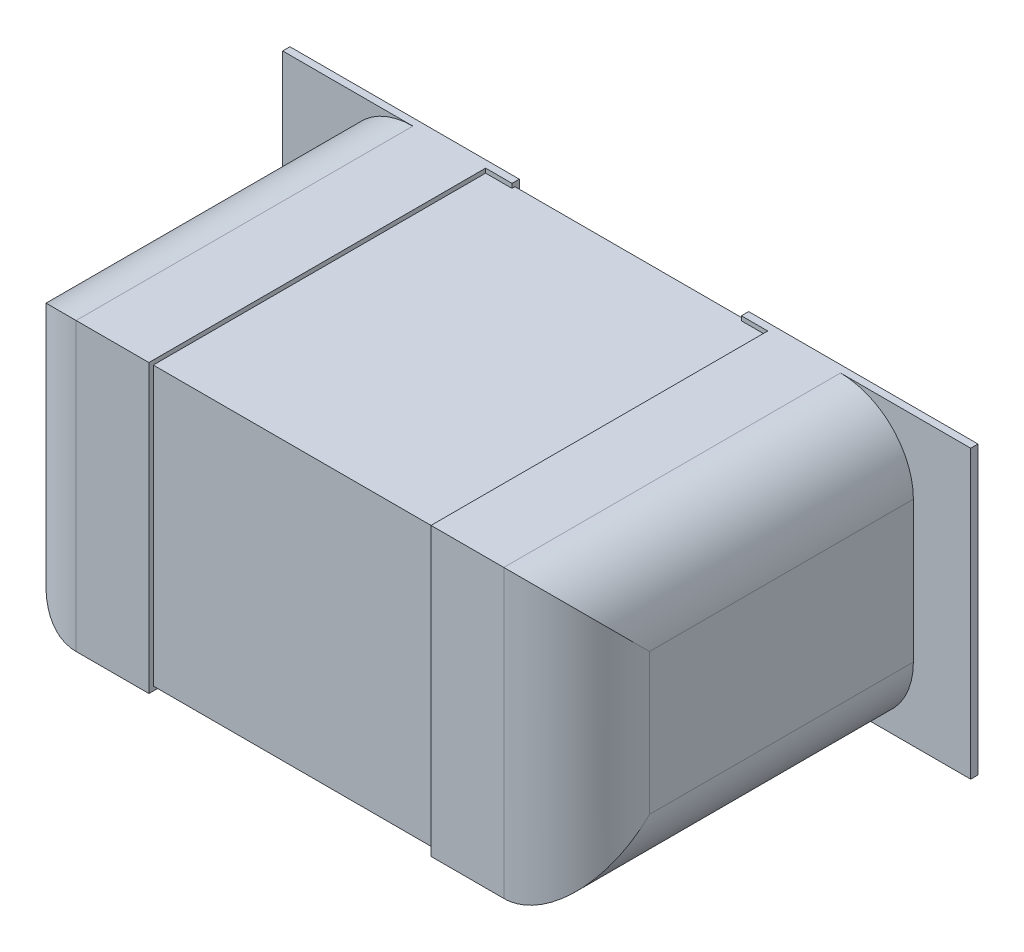
ISO-10303-21;
HEADER;
FILE_DESCRIPTION(('STEP AP214'),'2;1');
FILE_NAME('part.step','',(''),(''),'','','');
FILE_SCHEMA(('AUTOMOTIVE_DESIGN { 1 0 10303 214 1 1 1 1 }'));
ENDSEC;
DATA;
#1=APPLICATION_CONTEXT('core data for automotive mechanical design processes');
#2=APPLICATION_PROTOCOL_DEFINITION('international standard','automotive_design',2000,#1);
#3=PRODUCT_CONTEXT('',#1,'mechanical');
#4=PRODUCT('Part','Part','',(#3));
#5=PRODUCT_RELATED_PRODUCT_CATEGORY('part','',(#4));
#6=PRODUCT_DEFINITION_FORMATION('','',#4);
#7=PRODUCT_DEFINITION_CONTEXT('part definition',#1,'design');
#8=PRODUCT_DEFINITION('design','',#6,#7);
#9=PRODUCT_DEFINITION_SHAPE('','',#8);
#10=(LENGTH_UNIT() NAMED_UNIT(*) SI_UNIT(.MILLI.,.METRE.));
#11=(NAMED_UNIT(*) PLANE_ANGLE_UNIT() SI_UNIT($,.RADIAN.));
#12=(NAMED_UNIT(*) SI_UNIT($,.STERADIAN.) SOLID_ANGLE_UNIT());
#13=UNCERTAINTY_MEASURE_WITH_UNIT(LENGTH_MEASURE(1.E-05),#10,'distance_accuracy_value','');
#14=(GEOMETRIC_REPRESENTATION_CONTEXT(3) GLOBAL_UNCERTAINTY_ASSIGNED_CONTEXT((#13)) GLOBAL_UNIT_ASSIGNED_CONTEXT((#10,
#11,#12)) REPRESENTATION_CONTEXT('',''));
#15=CARTESIAN_POINT('',(0.,0.,0.));
#16=DIRECTION('',(0.,0.,1.));
#17=DIRECTION('',(1.,0.,0.));
#18=AXIS2_PLACEMENT_3D('',#15,#16,#17);
#19=CARTESIAN_POINT('',(0.500000000000032,-0.249999999999991,0.0762));
#20=DIRECTION('',(1.,0.,0.));
#21=DIRECTION('',(0.,0.,-1.));
#22=AXIS2_PLACEMENT_3D('',#19,#20,#21);
#23=PLANE('',#22);
#24=DIRECTION('',(0.,0.,-1.));
#25=VECTOR('',#24,1.);
#26=CARTESIAN_POINT('',(0.500000000000032,-0.122999999999991,0.678388339111896));
#27=LINE('',#26,#25);
#28=CARTESIAN_POINT('',(0.500000000000032,-0.122999999999991,0.0889));
#29=VERTEX_POINT('',#28);
#30=CARTESIAN_POINT('',(0.500000000000032,-0.122999999999991,0.549148));
#31=VERTEX_POINT('',#30);
#32=EDGE_CURVE('E325',#29,#31,#27,.F.);
#33=ORIENTED_EDGE('',*,*,#32,.F.);
#34=DIRECTION('',(0.,1.,0.));
#35=VECTOR('',#34,1.);
#36=CARTESIAN_POINT('',(0.500000000000032,0.,0.0889));
#37=LINE('',#36,#35);
#38=CARTESIAN_POINT('',(0.500000000000032,0.122999999999991,0.0889));
#39=VERTEX_POINT('',#38);
#40=EDGE_CURVE('E238',#39,#29,#37,.F.);
#41=ORIENTED_EDGE('',*,*,#40,.F.);
#42=DIRECTION('',(0.,0.,-1.));
#43=VECTOR('',#42,1.);
#44=CARTESIAN_POINT('',(0.500000000000032,0.122999999999991,0.678388339111896));
#45=LINE('',#44,#43);
#46=CARTESIAN_POINT('',(0.500000000000032,0.122999999999991,0.549148));
#47=VERTEX_POINT('',#46);
#48=EDGE_CURVE('E227',#47,#39,#45,.T.);
#49=ORIENTED_EDGE('',*,*,#48,.F.);
#50=DIRECTION('',(0.,1.,0.));
#51=VECTOR('',#50,1.);
#52=CARTESIAN_POINT('',(0.500000000000032,-0.252159075277437,0.549148));
#53=LINE('',#52,#51);
#54=EDGE_CURVE('E224',#31,#47,#53,.T.);
#55=ORIENTED_EDGE('',*,*,#54,.F.);
#56=EDGE_LOOP('',(#33,#41,#49,#55));
#57=FACE_BOUND('',#56,.T.);
#58=ADVANCED_FACE('F17',(#57),#23,.T.);
#59=CARTESIAN_POINT('',(-0.500000000000032,0.249999999999991,0.0762));
#60=DIRECTION('',(-1.,0.,0.));
#61=DIRECTION('',(0.,0.,1.));
#62=AXIS2_PLACEMENT_3D('',#59,#60,#61);
#63=PLANE('',#62);
#64=DIRECTION('',(0.,0.,-1.));
#65=VECTOR('',#64,1.);
#66=CARTESIAN_POINT('',(-0.500000000000032,0.122999999999991,0.678388339111896));
#67=LINE('',#66,#65);
#68=CARTESIAN_POINT('',(-0.500000000000032,0.122999999999991,0.0889));
#69=VERTEX_POINT('',#68);
#70=CARTESIAN_POINT('',(-0.500000000000032,0.122999999999991,0.549148));
#71=VERTEX_POINT('',#70);
#72=EDGE_CURVE('E309',#69,#71,#67,.F.);
#73=ORIENTED_EDGE('',*,*,#72,.F.);
#74=DIRECTION('',(0.,1.,0.));
#75=VECTOR('',#74,1.);
#76=CARTESIAN_POINT('',(-0.500000000000032,0.,0.0889));
#77=LINE('',#76,#75);
#78=CARTESIAN_POINT('',(-0.500000000000032,-0.122999999999991,0.0889));
#79=VERTEX_POINT('',#78);
#80=EDGE_CURVE('E313',#79,#69,#77,.T.);
#81=ORIENTED_EDGE('',*,*,#80,.F.);
#82=DIRECTION('',(0.,0.,-1.));
#83=VECTOR('',#82,1.);
#84=CARTESIAN_POINT('',(-0.500000000000032,-0.122999999999991,0.678388339111896));
#85=LINE('',#84,#83);
#86=CARTESIAN_POINT('',(-0.500000000000032,-0.122999999999991,0.549148));
#87=VERTEX_POINT('',#86);
#88=EDGE_CURVE('E316',#87,#79,#85,.T.);
#89=ORIENTED_EDGE('',*,*,#88,.F.);
#90=DIRECTION('',(0.,-1.,0.));
#91=VECTOR('',#90,1.);
#92=CARTESIAN_POINT('',(-0.500000000000032,0.252201511148649,0.549148));
#93=LINE('',#92,#91);
#94=EDGE_CURVE('E243',#71,#87,#93,.T.);
#95=ORIENTED_EDGE('',*,*,#94,.F.);
#96=EDGE_LOOP('',(#73,#81,#89,#95));
#97=FACE_BOUND('',#96,.T.);
#98=ADVANCED_FACE('F356',(#97),#63,.T.);
#99=CARTESIAN_POINT('',(-0.373000000000032,0.252201511148649,0.549148));
#100=DIRECTION('',(0.,-1.,0.));
#101=DIRECTION('',(0.,0.,-1.));
#102=AXIS2_PLACEMENT_3D('',#99,#100,#101);
#103=CYLINDRICAL_SURFACE('',#102,0.127);
#104=CARTESIAN_POINT('',(-0.373000000000032,-0.122999999999991,0.549148));
#105=DIRECTION('',(0.,-0.707106781186547,-0.707106781186547));
#106=DIRECTION('',(0.,0.707106781186547,-0.707106781186547));
#107=AXIS2_PLACEMENT_3D('',#104,#105,#106);
#108=ELLIPSE('',#107,0.179605122421383,0.127);
#109=CARTESIAN_POINT('',(-0.373000000000032,-0.249999999999991,0.676148));
#110=VERTEX_POINT('',#109);
#111=EDGE_CURVE('E317',#110,#87,#108,.T.);
#112=ORIENTED_EDGE('',*,*,#111,.F.);
#113=DIRECTION('',(0.,1.,0.));
#114=VECTOR('',#113,1.);
#115=CARTESIAN_POINT('',(-0.373000000000032,0.,0.676148));
#116=LINE('',#115,#114);
#117=CARTESIAN_POINT('',(-0.373000000000032,0.249999999999991,0.676148));
#118=VERTEX_POINT('',#117);
#119=EDGE_CURVE('E208',#118,#110,#116,.F.);
#120=ORIENTED_EDGE('',*,*,#119,.F.);
#121=CARTESIAN_POINT('',(-0.373000000000032,0.122999999999991,0.549148));
#122=DIRECTION('',(0.,0.707106781186547,-0.707106781186547));
#123=DIRECTION('',(0.,-0.707106781186547,-0.707106781186547));
#124=AXIS2_PLACEMENT_3D('',#121,#122,#123);
#125=ELLIPSE('',#124,0.179605122421383,0.127);
#126=EDGE_CURVE('E307',#71,#118,#125,.T.);
#127=ORIENTED_EDGE('',*,*,#126,.F.);
#128=ORIENTED_EDGE('',*,*,#94,.T.);
#129=EDGE_LOOP('',(#112,#120,#127,#128));
#130=FACE_BOUND('',#129,.T.);
#131=ADVANCED_FACE('F361',(#130),#103,.T.);
#132=CARTESIAN_POINT('',(0.373000000000032,-0.252159075277437,0.549148));
#133=DIRECTION('',(0.,1.,0.));
#134=DIRECTION('',(0.,0.,1.));
#135=AXIS2_PLACEMENT_3D('',#132,#133,#134);
#136=CYLINDRICAL_SURFACE('',#135,0.127);
#137=CARTESIAN_POINT('',(0.373000000000032,-0.122999999999991,0.549148));
#138=DIRECTION('',(0.,-0.707106781186547,-0.707106781186547));
#139=DIRECTION('',(0.,0.707106781186547,-0.707106781186547));
#140=AXIS2_PLACEMENT_3D('',#137,#138,#139);
#141=ELLIPSE('',#140,0.179605122421383,0.127);
#142=CARTESIAN_POINT('',(0.373000000000032,-0.249999999999991,0.676148));
#143=VERTEX_POINT('',#142);
#144=EDGE_CURVE('E323',#31,#143,#141,.T.);
#145=ORIENTED_EDGE('',*,*,#144,.F.);
#146=ORIENTED_EDGE('',*,*,#54,.T.);
#147=CARTESIAN_POINT('',(0.373000000000032,0.122999999999991,0.549148));
#148=DIRECTION('',(0.,0.707106781186547,-0.707106781186547));
#149=DIRECTION('',(0.,-0.707106781186547,-0.707106781186547));
#150=AXIS2_PLACEMENT_3D('',#147,#148,#149);
#151=ELLIPSE('',#150,0.179605122421383,0.127);
#152=CARTESIAN_POINT('',(0.373000000000032,0.249999999999991,0.676148));
#153=VERTEX_POINT('',#152);
#154=EDGE_CURVE('E20',#153,#47,#151,.T.);
#155=ORIENTED_EDGE('',*,*,#154,.F.);
#156=DIRECTION('',(0.,1.,0.));
#157=VECTOR('',#156,1.);
#158=CARTESIAN_POINT('',(0.373000000000032,0.,0.676148));
#159=LINE('',#158,#157);
#160=EDGE_CURVE('E198',#143,#153,#159,.T.);
#161=ORIENTED_EDGE('',*,*,#160,.F.);
#162=EDGE_LOOP('',(#145,#146,#155,#161));
#163=FACE_BOUND('',#162,.T.);
#164=ADVANCED_FACE('F222',(#163),#136,.T.);
#165=CARTESIAN_POINT('',(0.373000000000032,0.122999999999991,0.678388339111896));
#166=DIRECTION('',(0.,0.,-1.));
#167=DIRECTION('',(-1.,0.,0.));
#168=AXIS2_PLACEMENT_3D('',#165,#166,#167);
#169=CYLINDRICAL_SURFACE('',#168,0.127);
#170=ORIENTED_EDGE('',*,*,#48,.T.);
#171=CARTESIAN_POINT('',(0.373000000000032,0.122999999999991,0.0889));
#172=DIRECTION('',(0.,0.,-1.));
#173=DIRECTION('',(-1.,0.,0.));
#174=AXIS2_PLACEMENT_3D('',#171,#172,#173);
#175=CIRCLE('',#174,0.127);
#176=CARTESIAN_POINT('',(0.37286056684417,0.249999999999991,0.0889000165531471));
#177=VERTEX_POINT('',#176);
#178=EDGE_CURVE('E230',#177,#39,#175,.T.);
#179=ORIENTED_EDGE('',*,*,#178,.F.);
#180=DIRECTION('',(-0.000237434875660237,0.,-0.999999971812339));
#181=VECTOR('',#180,1.);
#182=CARTESIAN_POINT('',(0.373000000000032,0.249999999999991,0.676148));
#183=LINE('',#182,#181);
#184=EDGE_CURVE('E215',#153,#177,#183,.T.);
#185=ORIENTED_EDGE('',*,*,#184,.F.);
#186=ORIENTED_EDGE('',*,*,#154,.T.);
#187=EDGE_LOOP('',(#170,#179,#185,#186));
#188=FACE_BOUND('',#187,.T.);
#189=ADVANCED_FACE('F228',(#188),#169,.T.);
#190=CARTESIAN_POINT('',(0.5999988,-0.2500122,0.0762));
#191=DIRECTION('',(1.,0.,0.));
#192=DIRECTION('',(0.,0.,-1.));
#193=AXIS2_PLACEMENT_3D('',#190,#191,#192);
#194=PLANE('',#193);
#195=DIRECTION('',(0.,0.,-1.));
#196=VECTOR('',#195,1.);
#197=CARTESIAN_POINT('',(0.5999988,-0.249999999999991,0.0762));
#198=LINE('',#197,#196);
#199=CARTESIAN_POINT('',(0.5999988,-0.249999999999991,0.0762));
#200=VERTEX_POINT('',#199);
#201=CARTESIAN_POINT('',(0.5999988,-0.249999999999991,0.0889));
#202=VERTEX_POINT('',#201);
#203=EDGE_CURVE('E295',#200,#202,#198,.F.);
#204=ORIENTED_EDGE('',*,*,#203,.F.);
#205=DIRECTION('',(0.,1.,0.));
#206=VECTOR('',#205,1.);
#207=CARTESIAN_POINT('',(0.5999988,0.,0.0762));
#208=LINE('',#207,#206);
#209=CARTESIAN_POINT('',(0.5999988,0.249999999999991,0.0762));
#210=VERTEX_POINT('',#209);
#211=EDGE_CURVE('E298',#200,#210,#208,.T.);
#212=ORIENTED_EDGE('',*,*,#211,.T.);
#213=DIRECTION('',(0.,0.,1.));
#214=VECTOR('',#213,1.);
#215=CARTESIAN_POINT('',(0.5999988,0.249999999999991,0.0762));
#216=LINE('',#215,#214);
#217=CARTESIAN_POINT('',(0.5999988,0.249999999999991,0.0889));
#218=VERTEX_POINT('',#217);
#219=EDGE_CURVE('E234',#218,#210,#216,.F.);
#220=ORIENTED_EDGE('',*,*,#219,.F.);
#221=DIRECTION('',(0.,1.,0.));
#222=VECTOR('',#221,1.);
#223=CARTESIAN_POINT('',(0.5999988,0.,0.0889));
#224=LINE('',#223,#222);
#225=EDGE_CURVE('E241',#202,#218,#224,.T.);
#226=ORIENTED_EDGE('',*,*,#225,.F.);
#227=EDGE_LOOP('',(#204,#212,#220,#226));
#228=FACE_BOUND('',#227,.T.);
#229=ADVANCED_FACE('F336',(#228),#194,.T.);
#230=CARTESIAN_POINT('',(0.,0.,0.0889));
#231=DIRECTION('',(0.,0.,1.));
#232=DIRECTION('',(1.,0.,0.));
#233=AXIS2_PLACEMENT_3D('',#230,#231,#232);
#234=PLANE('',#233);
#235=ORIENTED_EDGE('',*,*,#178,.T.);
#236=ORIENTED_EDGE('',*,*,#40,.T.);
#237=CARTESIAN_POINT('',(0.373000000000032,-0.122999999999991,0.0889));
#238=DIRECTION('',(0.,0.,-1.));
#239=DIRECTION('',(-1.,0.,0.));
#240=AXIS2_PLACEMENT_3D('',#237,#238,#239);
#241=CIRCLE('',#240,0.127);
#242=CARTESIAN_POINT('',(0.37286056684417,-0.249999999999991,0.088900016553147));
#243=VERTEX_POINT('',#242);
#244=EDGE_CURVE('E320',#243,#29,#241,.F.);
#245=ORIENTED_EDGE('',*,*,#244,.F.);
#246=DIRECTION('',(1.,0.,0.));
#247=VECTOR('',#246,1.);
#248=CARTESIAN_POINT('',(-0.500000000000032,-0.249999999999991,0.0889));
#249=LINE('',#248,#247);
#250=EDGE_CURVE('E297',#202,#243,#249,.F.);
#251=ORIENTED_EDGE('',*,*,#250,.F.);
#252=ORIENTED_EDGE('',*,*,#225,.T.);
#253=DIRECTION('',(1.,0.,0.));
#254=VECTOR('',#253,1.);
#255=CARTESIAN_POINT('',(0.500000000000032,0.249999999999991,0.0889));
#256=LINE('',#255,#254);
#257=EDGE_CURVE('E232',#177,#218,#256,.T.);
#258=ORIENTED_EDGE('',*,*,#257,.F.);
#259=EDGE_LOOP('',(#235,#236,#245,#251,#252,#258));
#260=FACE_BOUND('',#259,.T.);
#261=ADVANCED_FACE('F329',(#260),#234,.T.);
#262=CARTESIAN_POINT('',(0.373000000000032,-0.122999999999991,0.678388339111896));
#263=DIRECTION('',(0.,0.,-1.));
#264=DIRECTION('',(-1.,0.,0.));
#265=AXIS2_PLACEMENT_3D('',#262,#263,#264);
#266=CYLINDRICAL_SURFACE('',#265,0.127);
#267=DIRECTION('',(0.000237434875660237,0.,0.999999971812339));
#268=VECTOR('',#267,1.);
#269=CARTESIAN_POINT('',(0.37286056684024,-0.249999999999991,0.0889));
#270=LINE('',#269,#268);
#271=EDGE_CURVE('E343',#243,#143,#270,.T.);
#272=ORIENTED_EDGE('',*,*,#271,.F.);
#273=ORIENTED_EDGE('',*,*,#244,.T.);
#274=ORIENTED_EDGE('',*,*,#32,.T.);
#275=ORIENTED_EDGE('',*,*,#144,.T.);
#276=EDGE_LOOP('',(#272,#273,#274,#275));
#277=FACE_BOUND('',#276,.T.);
#278=ADVANCED_FACE('F353',(#277),#266,.T.);
#279=CARTESIAN_POINT('',(-0.373000000000032,-0.122999999999991,0.678388339111896));
#280=DIRECTION('',(0.,0.,-1.));
#281=DIRECTION('',(-1.,0.,0.));
#282=AXIS2_PLACEMENT_3D('',#279,#280,#281);
#283=CYLINDRICAL_SURFACE('',#282,0.127);
#284=ORIENTED_EDGE('',*,*,#88,.T.);
#285=CARTESIAN_POINT('',(-0.373000000000032,-0.122999999999991,0.0889));
#286=DIRECTION('',(0.,0.,-1.));
#287=DIRECTION('',(-1.,0.,0.));
#288=AXIS2_PLACEMENT_3D('',#285,#286,#287);
#289=CIRCLE('',#288,0.127);
#290=CARTESIAN_POINT('',(-0.37286056684417,-0.249999999999991,0.0889000165531471));
#291=VERTEX_POINT('',#290);
#292=EDGE_CURVE('E310',#291,#79,#289,.T.);
#293=ORIENTED_EDGE('',*,*,#292,.F.);
#294=DIRECTION('',(0.000237434875660237,0.,-0.999999971812339));
#295=VECTOR('',#294,1.);
#296=CARTESIAN_POINT('',(-0.373000000000032,-0.249999999999991,0.676148));
#297=LINE('',#296,#295);
#298=EDGE_CURVE('E290',#110,#291,#297,.T.);
#299=ORIENTED_EDGE('',*,*,#298,.F.);
#300=ORIENTED_EDGE('',*,*,#111,.T.);
#301=EDGE_LOOP('',(#284,#293,#299,#300));
#302=FACE_BOUND('',#301,.T.);
#303=ADVANCED_FACE('F450',(#302),#283,.T.);
#304=CARTESIAN_POINT('',(-0.5999988,0.2500122,0.0762));
#305=DIRECTION('',(-1.,0.,0.));
#306=DIRECTION('',(0.,0.,1.));
#307=AXIS2_PLACEMENT_3D('',#304,#305,#306);
#308=PLANE('',#307);
#309=DIRECTION('',(0.,0.,1.));
#310=VECTOR('',#309,1.);
#311=CARTESIAN_POINT('',(-0.5999988,0.249999999999991,0.0762));
#312=LINE('',#311,#310);
#313=CARTESIAN_POINT('',(-0.5999988,0.249999999999991,0.0762));
#314=VERTEX_POINT('',#313);
#315=CARTESIAN_POINT('',(-0.5999988,0.249999999999991,0.0889));
#316=VERTEX_POINT('',#315);
#317=EDGE_CURVE('E278',#314,#316,#312,.T.);
#318=ORIENTED_EDGE('',*,*,#317,.F.);
#319=DIRECTION('',(0.,1.,0.));
#320=VECTOR('',#319,1.);
#321=CARTESIAN_POINT('',(-0.5999988,0.,0.0762));
#322=LINE('',#321,#320);
#323=CARTESIAN_POINT('',(-0.5999988,-0.249999999999991,0.0762));
#324=VERTEX_POINT('',#323);
#325=EDGE_CURVE('E281',#314,#324,#322,.F.);
#326=ORIENTED_EDGE('',*,*,#325,.T.);
#327=DIRECTION('',(0.,0.,-1.));
#328=VECTOR('',#327,1.);
#329=CARTESIAN_POINT('',(-0.5999988,-0.249999999999991,0.0762));
#330=LINE('',#329,#328);
#331=CARTESIAN_POINT('',(-0.5999988,-0.249999999999991,0.0889));
#332=VERTEX_POINT('',#331);
#333=EDGE_CURVE('E285',#332,#324,#330,.T.);
#334=ORIENTED_EDGE('',*,*,#333,.F.);
#335=DIRECTION('',(0.,1.,0.));
#336=VECTOR('',#335,1.);
#337=CARTESIAN_POINT('',(-0.5999988,0.,0.0889));
#338=LINE('',#337,#336);
#339=EDGE_CURVE('E314',#316,#332,#338,.F.);
#340=ORIENTED_EDGE('',*,*,#339,.F.);
#341=EDGE_LOOP('',(#318,#326,#334,#340));
#342=FACE_BOUND('',#341,.T.);
#343=ADVANCED_FACE('F446',(#342),#308,.T.);
#344=CARTESIAN_POINT('',(0.,0.,0.0889));
#345=DIRECTION('',(0.,0.,1.));
#346=DIRECTION('',(1.,0.,0.));
#347=AXIS2_PLACEMENT_3D('',#344,#345,#346);
#348=PLANE('',#347);
#349=ORIENTED_EDGE('',*,*,#292,.T.);
#350=ORIENTED_EDGE('',*,*,#80,.T.);
#351=CARTESIAN_POINT('',(-0.373000000000032,0.122999999999991,0.0889));
#352=DIRECTION('',(0.,0.,-1.));
#353=DIRECTION('',(-1.,0.,0.));
#354=AXIS2_PLACEMENT_3D('',#351,#352,#353);
#355=CIRCLE('',#354,0.127);
#356=CARTESIAN_POINT('',(-0.37286056684417,0.249999999999991,0.088900016553147));
#357=VERTEX_POINT('',#356);
#358=EDGE_CURVE('E304',#357,#69,#355,.F.);
#359=ORIENTED_EDGE('',*,*,#358,.F.);
#360=DIRECTION('',(1.,0.,0.));
#361=VECTOR('',#360,1.);
#362=CARTESIAN_POINT('',(0.500000000000032,0.249999999999991,0.0889));
#363=LINE('',#362,#361);
#364=EDGE_CURVE('E280',#316,#357,#363,.T.);
#365=ORIENTED_EDGE('',*,*,#364,.F.);
#366=ORIENTED_EDGE('',*,*,#339,.T.);
#367=DIRECTION('',(1.,0.,0.));
#368=VECTOR('',#367,1.);
#369=CARTESIAN_POINT('',(-0.500000000000032,-0.249999999999991,0.0889));
#370=LINE('',#369,#368);
#371=EDGE_CURVE('E287',#291,#332,#370,.F.);
#372=ORIENTED_EDGE('',*,*,#371,.F.);
#373=EDGE_LOOP('',(#349,#350,#359,#365,#366,#372));
#374=FACE_BOUND('',#373,.T.);
#375=ADVANCED_FACE('F442',(#374),#348,.T.);
#376=CARTESIAN_POINT('',(-0.373000000000032,0.122999999999991,0.678388339111896));
#377=DIRECTION('',(0.,0.,-1.));
#378=DIRECTION('',(-1.,0.,0.));
#379=AXIS2_PLACEMENT_3D('',#376,#377,#378);
#380=CYLINDRICAL_SURFACE('',#379,0.127);
#381=DIRECTION('',(-0.000237434875660237,0.,0.999999971812339));
#382=VECTOR('',#381,1.);
#383=CARTESIAN_POINT('',(-0.37286056684024,0.249999999999991,0.0889));
#384=LINE('',#383,#382);
#385=EDGE_CURVE('E483',#357,#118,#384,.T.);
#386=ORIENTED_EDGE('',*,*,#385,.F.);
#387=ORIENTED_EDGE('',*,*,#358,.T.);
#388=ORIENTED_EDGE('',*,*,#72,.T.);
#389=ORIENTED_EDGE('',*,*,#126,.T.);
#390=EDGE_LOOP('',(#386,#387,#388,#389));
#391=FACE_BOUND('',#390,.T.);
#392=ADVANCED_FACE('F438',(#391),#380,.T.);
#393=CARTESIAN_POINT('',(0.,0.,0.676148));
#394=DIRECTION('',(0.,0.,1.));
#395=DIRECTION('',(1.,0.,0.));
#396=AXIS2_PLACEMENT_3D('',#393,#394,#395);
#397=PLANE('',#396);
#398=DIRECTION('',(1.,0.,0.));
#399=VECTOR('',#398,1.);
#400=CARTESIAN_POINT('',(0.500000000000032,0.249999999999991,0.676148));
#401=LINE('',#400,#399);
#402=CARTESIAN_POINT('',(-0.246000000000007,0.249999999999991,0.676148));
#403=VERTEX_POINT('',#402);
#404=EDGE_CURVE('E277',#118,#403,#401,.T.);
#405=ORIENTED_EDGE('',*,*,#404,.F.);
#406=ORIENTED_EDGE('',*,*,#119,.T.);
#407=DIRECTION('',(1.,0.,0.));
#408=VECTOR('',#407,1.);
#409=CARTESIAN_POINT('',(-0.500000000000032,-0.249999999999991,0.676148));
#410=LINE('',#409,#408);
#411=CARTESIAN_POINT('',(-0.246000000000007,-0.250002711111104,0.676148));
#412=VERTEX_POINT('',#411);
#413=EDGE_CURVE('E294',#412,#110,#410,.F.);
#414=ORIENTED_EDGE('',*,*,#413,.F.);
#415=DIRECTION('',(0.,1.,0.));
#416=VECTOR('',#415,1.);
#417=CARTESIAN_POINT('',(-0.246000000000007,-0.249999999999991,0.676148));
#418=LINE('',#417,#416);
#419=EDGE_CURVE('E514',#412,#403,#418,.T.);
#420=ORIENTED_EDGE('',*,*,#419,.T.);
#421=EDGE_LOOP('',(#405,#406,#414,#420));
#422=FACE_BOUND('',#421,.T.);
#423=ADVANCED_FACE('F435',(#422),#397,.T.);
#424=CARTESIAN_POINT('',(0.,0.,0.676148));
#425=DIRECTION('',(0.,0.,1.));
#426=DIRECTION('',(1.,0.,0.));
#427=AXIS2_PLACEMENT_3D('',#424,#425,#426);
#428=PLANE('',#427);
#429=DIRECTION('',(1.,0.,0.));
#430=VECTOR('',#429,1.);
#431=CARTESIAN_POINT('',(-0.500000000000032,-0.249999999999991,0.676148));
#432=LINE('',#431,#430);
#433=CARTESIAN_POINT('',(0.246000000000007,-0.249999999999991,0.676148));
#434=VERTEX_POINT('',#433);
#435=EDGE_CURVE('E204',#143,#434,#432,.F.);
#436=ORIENTED_EDGE('',*,*,#435,.F.);
#437=ORIENTED_EDGE('',*,*,#160,.T.);
#438=DIRECTION('',(1.,0.,0.));
#439=VECTOR('',#438,1.);
#440=CARTESIAN_POINT('',(0.500000000000032,0.249999999999991,0.676148));
#441=LINE('',#440,#439);
#442=CARTESIAN_POINT('',(0.246000000000007,0.250002711111104,0.676148));
#443=VERTEX_POINT('',#442);
#444=EDGE_CURVE('E202',#443,#153,#441,.T.);
#445=ORIENTED_EDGE('',*,*,#444,.F.);
#446=DIRECTION('',(0.,1.,0.));
#447=VECTOR('',#446,1.);
#448=CARTESIAN_POINT('',(0.246000000000007,-0.249999999999991,0.676148));
#449=LINE('',#448,#447);
#450=EDGE_CURVE('E569',#443,#434,#449,.F.);
#451=ORIENTED_EDGE('',*,*,#450,.T.);
#452=EDGE_LOOP('',(#436,#437,#445,#451));
#453=FACE_BOUND('',#452,.T.);
#454=ADVANCED_FACE('F200',(#453),#428,.T.);
#455=CARTESIAN_POINT('',(0.,0.,0.0889));
#456=DIRECTION('',(0.,0.,1.));
#457=DIRECTION('',(1.,0.,0.));
#458=AXIS2_PLACEMENT_3D('',#455,#456,#457);
#459=PLANE('',#458);
#460=DIRECTION('',(1.,0.,0.));
#461=VECTOR('',#460,1.);
#462=CARTESIAN_POINT('',(-0.246000000000007,0.242379999999991,0.0889));
#463=LINE('',#462,#461);
#464=CARTESIAN_POINT('',(0.1999996,0.242379999999991,0.0889));
#465=VERTEX_POINT('',#464);
#466=CARTESIAN_POINT('',(0.246000000000007,0.242379999999991,0.0889));
#467=VERTEX_POINT('',#466);
#468=EDGE_CURVE('E530',#465,#467,#463,.T.);
#469=ORIENTED_EDGE('',*,*,#468,.T.);
#470=DIRECTION('',(0.,1.,0.));
#471=VECTOR('',#470,1.);
#472=CARTESIAN_POINT('',(0.246000000000007,-0.249999999999991,0.0889));
#473=LINE('',#472,#471);
#474=CARTESIAN_POINT('',(0.246000000000007,0.250002033333325,0.0889));
#475=VERTEX_POINT('',#474);
#476=EDGE_CURVE('E559',#467,#475,#473,.T.);
#477=ORIENTED_EDGE('',*,*,#476,.T.);
#478=DIRECTION('',(1.,0.,0.));
#479=VECTOR('',#478,1.);
#480=CARTESIAN_POINT('',(0.500000000000032,0.249999999999991,0.0889));
#481=LINE('',#480,#479);
#482=CARTESIAN_POINT('',(0.1999996,0.249999999999991,0.0889));
#483=VERTEX_POINT('',#482);
#484=EDGE_CURVE('E302',#483,#475,#481,.T.);
#485=ORIENTED_EDGE('',*,*,#484,.F.);
#486=DIRECTION('',(0.,1.,0.));
#487=VECTOR('',#486,1.);
#488=CARTESIAN_POINT('',(0.1999996,0.2500122,0.0889));
#489=LINE('',#488,#487);
#490=EDGE_CURVE('E258',#465,#483,#489,.T.);
#491=ORIENTED_EDGE('',*,*,#490,.F.);
#492=EDGE_LOOP('',(#469,#477,#485,#491));
#493=FACE_BOUND('',#492,.T.);
#494=ADVANCED_FACE('F429',(#493),#459,.T.);
#495=CARTESIAN_POINT('',(0.500000000000032,0.249999999999991,0.0762));
#496=DIRECTION('',(0.,1.,0.));
#497=DIRECTION('',(0.,0.,1.));
#498=AXIS2_PLACEMENT_3D('',#495,#496,#497);
#499=PLANE('',#498);
#500=ORIENTED_EDGE('',*,*,#484,.T.);
#501=DIRECTION('',(0.,0.,-1.));
#502=VECTOR('',#501,1.);
#503=CARTESIAN_POINT('',(0.246000000000007,0.25000406666666,0.08382));
#504=LINE('',#503,#502);
#505=EDGE_CURVE('E218',#475,#443,#504,.F.);
#506=ORIENTED_EDGE('',*,*,#505,.T.);
#507=ORIENTED_EDGE('',*,*,#444,.T.);
#508=ORIENTED_EDGE('',*,*,#184,.T.);
#509=ORIENTED_EDGE('',*,*,#257,.T.);
#510=ORIENTED_EDGE('',*,*,#219,.T.);
#511=DIRECTION('',(1.,0.,0.));
#512=VECTOR('',#511,1.);
#513=CARTESIAN_POINT('',(0.500000000000032,0.249999999999991,0.0762));
#514=LINE('',#513,#512);
#515=CARTESIAN_POINT('',(0.1999996,0.249999999999991,0.0762));
#516=VERTEX_POINT('',#515);
#517=EDGE_CURVE('E299',#210,#516,#514,.F.);
#518=ORIENTED_EDGE('',*,*,#517,.T.);
#519=DIRECTION('',(0.,0.,-1.));
#520=VECTOR('',#519,1.);
#521=CARTESIAN_POINT('',(0.1999996,0.249999999999991,0.0762));
#522=LINE('',#521,#520);
#523=EDGE_CURVE('E256',#483,#516,#522,.T.);
#524=ORIENTED_EDGE('',*,*,#523,.F.);
#525=EDGE_LOOP('',(#500,#506,#507,#508,#509,#510,#518,#524));
#526=FACE_BOUND('',#525,.T.);
#527=ADVANCED_FACE('F212',(#526),#499,.T.);
#528=CARTESIAN_POINT('',(0.,0.,0.0762));
#529=DIRECTION('',(0.,0.,1.));
#530=DIRECTION('',(1.,0.,0.));
#531=AXIS2_PLACEMENT_3D('',#528,#529,#530);
#532=PLANE('',#531);
#533=DIRECTION('',(1.,0.,0.));
#534=VECTOR('',#533,1.);
#535=CARTESIAN_POINT('',(-0.500000000000032,-0.249999999999991,0.0762));
#536=LINE('',#535,#534);
#537=CARTESIAN_POINT('',(0.1999996,-0.249999999999991,0.0762));
#538=VERTEX_POINT('',#537);
#539=EDGE_CURVE('E291',#538,#200,#536,.T.);
#540=ORIENTED_EDGE('',*,*,#539,.F.);
#541=DIRECTION('',(0.,1.,0.));
#542=VECTOR('',#541,1.);
#543=CARTESIAN_POINT('',(0.1999996,0.2500122,0.0762));
#544=LINE('',#543,#542);
#545=EDGE_CURVE('E255',#516,#538,#544,.F.);
#546=ORIENTED_EDGE('',*,*,#545,.F.);
#547=ORIENTED_EDGE('',*,*,#517,.F.);
#548=ORIENTED_EDGE('',*,*,#211,.F.);
#549=EDGE_LOOP('',(#540,#546,#547,#548));
#550=FACE_BOUND('',#549,.T.);
#551=ADVANCED_FACE('F424',(#550),#532,.F.);
#552=CARTESIAN_POINT('',(-0.500000000000032,-0.249999999999991,0.0762));
#553=DIRECTION('',(0.,-1.,0.));
#554=DIRECTION('',(0.,0.,-1.));
#555=AXIS2_PLACEMENT_3D('',#552,#553,#554);
#556=PLANE('',#555);
#557=DIRECTION('',(0.,0.,1.));
#558=VECTOR('',#557,1.);
#559=CARTESIAN_POINT('',(0.1999996,-0.249999999999991,0.0762));
#560=LINE('',#559,#558);
#561=CARTESIAN_POINT('',(0.1999996,-0.249999999999991,0.0889));
#562=VERTEX_POINT('',#561);
#563=EDGE_CURVE('E252',#538,#562,#560,.T.);
#564=ORIENTED_EDGE('',*,*,#563,.F.);
#565=ORIENTED_EDGE('',*,*,#539,.T.);
#566=ORIENTED_EDGE('',*,*,#203,.T.);
#567=ORIENTED_EDGE('',*,*,#250,.T.);
#568=ORIENTED_EDGE('',*,*,#271,.T.);
#569=ORIENTED_EDGE('',*,*,#435,.T.);
#570=DIRECTION('',(0.,0.,-1.));
#571=VECTOR('',#570,1.);
#572=CARTESIAN_POINT('',(0.246000000000007,-0.249999999999991,0.08382));
#573=LINE('',#572,#571);
#574=CARTESIAN_POINT('',(0.246000000000007,-0.249999999999991,0.0889));
#575=VERTEX_POINT('',#574);
#576=EDGE_CURVE('E265',#434,#575,#573,.T.);
#577=ORIENTED_EDGE('',*,*,#576,.T.);
#578=DIRECTION('',(1.,0.,0.));
#579=VECTOR('',#578,1.);
#580=CARTESIAN_POINT('',(0.,-0.249999999999991,0.0889));
#581=LINE('',#580,#579);
#582=EDGE_CURVE('E259',#562,#575,#581,.T.);
#583=ORIENTED_EDGE('',*,*,#582,.F.);
#584=EDGE_LOOP('',(#564,#565,#566,#567,#568,#569,#577,#583));
#585=FACE_BOUND('',#584,.T.);
#586=ADVANCED_FACE('F348',(#585),#556,.T.);
#587=CARTESIAN_POINT('',(-0.500000000000032,-0.249999999999991,0.0762));
#588=DIRECTION('',(0.,-1.,0.));
#589=DIRECTION('',(0.,0.,-1.));
#590=AXIS2_PLACEMENT_3D('',#587,#588,#589);
#591=PLANE('',#590);
#592=DIRECTION('',(1.,0.,0.));
#593=VECTOR('',#592,1.);
#594=CARTESIAN_POINT('',(0.,-0.25000406666666,0.0889));
#595=LINE('',#594,#593);
#596=CARTESIAN_POINT('',(-0.246000000000007,-0.250003388888882,0.0889));
#597=VERTEX_POINT('',#596);
#598=CARTESIAN_POINT('',(-0.1999996,-0.250002033333325,0.0889));
#599=VERTEX_POINT('',#598);
#600=EDGE_CURVE('E507',#597,#599,#595,.T.);
#601=ORIENTED_EDGE('',*,*,#600,.F.);
#602=DIRECTION('',(0.,0.,1.));
#603=VECTOR('',#602,1.);
#604=CARTESIAN_POINT('',(-0.246000000000007,-0.25000406666666,0.0762));
#605=LINE('',#604,#603);
#606=EDGE_CURVE('E506',#597,#412,#605,.T.);
#607=ORIENTED_EDGE('',*,*,#606,.T.);
#608=ORIENTED_EDGE('',*,*,#413,.T.);
#609=ORIENTED_EDGE('',*,*,#298,.T.);
#610=ORIENTED_EDGE('',*,*,#371,.T.);
#611=ORIENTED_EDGE('',*,*,#333,.T.);
#612=DIRECTION('',(1.,0.,0.));
#613=VECTOR('',#612,1.);
#614=CARTESIAN_POINT('',(-0.500000000000032,-0.249999999999991,0.0762));
#615=LINE('',#614,#613);
#616=CARTESIAN_POINT('',(-0.1999996,-0.249999999999991,0.0762));
#617=VERTEX_POINT('',#616);
#618=EDGE_CURVE('E282',#324,#617,#615,.T.);
#619=ORIENTED_EDGE('',*,*,#618,.T.);
#620=DIRECTION('',(0.,0.,-1.));
#621=VECTOR('',#620,1.);
#622=CARTESIAN_POINT('',(-0.1999996,-0.249999999999991,0.0762));
#623=LINE('',#622,#621);
#624=EDGE_CURVE('E249',#599,#617,#623,.T.);
#625=ORIENTED_EDGE('',*,*,#624,.F.);
#626=EDGE_LOOP('',(#601,#607,#608,#609,#610,#611,#619,#625));
#627=FACE_BOUND('',#626,.T.);
#628=ADVANCED_FACE('F417',(#627),#591,.T.);
#629=CARTESIAN_POINT('',(0.,0.,0.0762));
#630=DIRECTION('',(0.,0.,1.));
#631=DIRECTION('',(1.,0.,0.));
#632=AXIS2_PLACEMENT_3D('',#629,#630,#631);
#633=PLANE('',#632);
#634=DIRECTION('',(1.,0.,0.));
#635=VECTOR('',#634,1.);
#636=CARTESIAN_POINT('',(0.500000000000032,0.249999999999991,0.0762));
#637=LINE('',#636,#635);
#638=CARTESIAN_POINT('',(-0.1999996,0.249999999999991,0.0762));
#639=VERTEX_POINT('',#638);
#640=EDGE_CURVE('E274',#639,#314,#637,.F.);
#641=ORIENTED_EDGE('',*,*,#640,.F.);
#642=DIRECTION('',(0.,1.,0.));
#643=VECTOR('',#642,1.);
#644=CARTESIAN_POINT('',(-0.1999996,-0.2500122,0.0762));
#645=LINE('',#644,#643);
#646=EDGE_CURVE('E248',#617,#639,#645,.T.);
#647=ORIENTED_EDGE('',*,*,#646,.F.);
#648=ORIENTED_EDGE('',*,*,#618,.F.);
#649=ORIENTED_EDGE('',*,*,#325,.F.);
#650=EDGE_LOOP('',(#641,#647,#648,#649));
#651=FACE_BOUND('',#650,.T.);
#652=ADVANCED_FACE('F413',(#651),#633,.F.);
#653=CARTESIAN_POINT('',(0.500000000000032,0.249999999999991,0.0762));
#654=DIRECTION('',(0.,1.,0.));
#655=DIRECTION('',(0.,0.,1.));
#656=AXIS2_PLACEMENT_3D('',#653,#654,#655);
#657=PLANE('',#656);
#658=DIRECTION('',(0.,0.,1.));
#659=VECTOR('',#658,1.);
#660=CARTESIAN_POINT('',(-0.1999996,0.249999999999991,0.0762));
#661=LINE('',#660,#659);
#662=CARTESIAN_POINT('',(-0.1999996,0.249999999999991,0.0889));
#663=VERTEX_POINT('',#662);
#664=EDGE_CURVE('E245',#639,#663,#661,.T.);
#665=ORIENTED_EDGE('',*,*,#664,.F.);
#666=ORIENTED_EDGE('',*,*,#640,.T.);
#667=ORIENTED_EDGE('',*,*,#317,.T.);
#668=ORIENTED_EDGE('',*,*,#364,.T.);
#669=ORIENTED_EDGE('',*,*,#385,.T.);
#670=ORIENTED_EDGE('',*,*,#404,.T.);
#671=DIRECTION('',(0.,0.,1.));
#672=VECTOR('',#671,1.);
#673=CARTESIAN_POINT('',(-0.246000000000007,0.249999999999991,0.0762));
#674=LINE('',#673,#672);
#675=CARTESIAN_POINT('',(-0.246000000000007,0.249999999999991,0.0889));
#676=VERTEX_POINT('',#675);
#677=EDGE_CURVE('E270',#403,#676,#674,.F.);
#678=ORIENTED_EDGE('',*,*,#677,.T.);
#679=DIRECTION('',(-1.,0.,0.));
#680=VECTOR('',#679,1.);
#681=CARTESIAN_POINT('',(0.,0.249999999999991,0.0889));
#682=LINE('',#681,#680);
#683=EDGE_CURVE('E271',#663,#676,#682,.T.);
#684=ORIENTED_EDGE('',*,*,#683,.F.);
#685=EDGE_LOOP('',(#665,#666,#667,#668,#669,#670,#678,#684));
#686=FACE_BOUND('',#685,.T.);
#687=ADVANCED_FACE('F409',(#686),#657,.T.);
#688=CARTESIAN_POINT('',(0.,0.,0.0889));
#689=DIRECTION('',(0.,0.,1.));
#690=DIRECTION('',(1.,0.,0.));
#691=AXIS2_PLACEMENT_3D('',#688,#689,#690);
#692=PLANE('',#691);
#693=DIRECTION('',(0.,1.,0.));
#694=VECTOR('',#693,1.);
#695=CARTESIAN_POINT('',(-0.1999996,-0.2500122,0.0889));
#696=LINE('',#695,#694);
#697=CARTESIAN_POINT('',(-0.1999996,0.242379999999991,0.0889));
#698=VERTEX_POINT('',#697);
#699=EDGE_CURVE('E247',#663,#698,#696,.F.);
#700=ORIENTED_EDGE('',*,*,#699,.F.);
#701=ORIENTED_EDGE('',*,*,#683,.T.);
#702=DIRECTION('',(0.,1.,0.));
#703=VECTOR('',#702,1.);
#704=CARTESIAN_POINT('',(-0.246000000000007,0.,0.0889));
#705=LINE('',#704,#703);
#706=CARTESIAN_POINT('',(-0.246000000000007,0.242379999999991,0.0889));
#707=VERTEX_POINT('',#706);
#708=EDGE_CURVE('E266',#676,#707,#705,.F.);
#709=ORIENTED_EDGE('',*,*,#708,.T.);
#710=DIRECTION('',(1.,0.,0.));
#711=VECTOR('',#710,1.);
#712=CARTESIAN_POINT('',(-0.246000000000007,0.242379999999991,0.0889));
#713=LINE('',#712,#711);
#714=EDGE_CURVE('E273',#707,#698,#713,.T.);
#715=ORIENTED_EDGE('',*,*,#714,.T.);
#716=EDGE_LOOP('',(#700,#701,#709,#715));
#717=FACE_BOUND('',#716,.T.);
#718=ADVANCED_FACE('F405',(#717),#692,.T.);
#719=CARTESIAN_POINT('',(-0.246000000000007,0.242379999999991,0.0762));
#720=DIRECTION('',(0.,-1.,0.));
#721=DIRECTION('',(0.,0.,-1.));
#722=AXIS2_PLACEMENT_3D('',#719,#720,#721);
#723=PLANE('',#722);
#724=DIRECTION('',(-1.,0.,0.));
#725=VECTOR('',#724,1.);
#726=CARTESIAN_POINT('',(-0.246000000000007,0.242379999999991,0.668528));
#727=LINE('',#726,#725);
#728=CARTESIAN_POINT('',(-0.246000000000007,0.242379999999991,0.668528));
#729=VERTEX_POINT('',#728);
#730=CARTESIAN_POINT('',(0.246000000000007,0.242379999999991,0.668528));
#731=VERTEX_POINT('',#730);
#732=EDGE_CURVE('E537',#729,#731,#727,.F.);
#733=ORIENTED_EDGE('',*,*,#732,.T.);
#734=DIRECTION('',(0.,0.,-1.));
#735=VECTOR('',#734,1.);
#736=CARTESIAN_POINT('',(0.246000000000007,0.242379999999991,0.08382));
#737=LINE('',#736,#735);
#738=EDGE_CURVE('E554',#731,#467,#737,.T.);
#739=ORIENTED_EDGE('',*,*,#738,.T.);
#740=ORIENTED_EDGE('',*,*,#468,.F.);
#741=DIRECTION('',(0.,0.,1.));
#742=VECTOR('',#741,1.);
#743=CARTESIAN_POINT('',(0.1999996,0.242379999999991,0.0762));
#744=LINE('',#743,#742);
#745=CARTESIAN_POINT('',(0.1999996,0.242379999999991,0.08382));
#746=VERTEX_POINT('',#745);
#747=EDGE_CURVE('E262',#746,#465,#744,.T.);
#748=ORIENTED_EDGE('',*,*,#747,.F.);
#749=DIRECTION('',(1.,0.,0.));
#750=VECTOR('',#749,1.);
#751=CARTESIAN_POINT('',(-0.246000000000007,0.242379999999991,0.08382));
#752=LINE('',#751,#750);
#753=CARTESIAN_POINT('',(-0.1999996,0.242379999999991,0.08382));
#754=VERTEX_POINT('',#753);
#755=EDGE_CURVE('E592',#746,#754,#752,.F.);
#756=ORIENTED_EDGE('',*,*,#755,.T.);
#757=DIRECTION('',(0.,0.,-1.));
#758=VECTOR('',#757,1.);
#759=CARTESIAN_POINT('',(-0.1999996,0.242379999999991,0.0762));
#760=LINE('',#759,#758);
#761=EDGE_CURVE('E492',#698,#754,#760,.T.);
#762=ORIENTED_EDGE('',*,*,#761,.F.);
#763=ORIENTED_EDGE('',*,*,#714,.F.);
#764=DIRECTION('',(0.,0.,1.));
#765=VECTOR('',#764,1.);
#766=CARTESIAN_POINT('',(-0.246000000000007,0.242379999999991,0.0762));
#767=LINE('',#766,#765);
#768=EDGE_CURVE('E269',#707,#729,#767,.T.);
#769=ORIENTED_EDGE('',*,*,#768,.T.);
#770=EDGE_LOOP('',(#733,#739,#740,#748,#756,#762,#763,#769));
#771=FACE_BOUND('',#770,.T.);
#772=ADVANCED_FACE('F401',(#771),#723,.F.);
#773=CARTESIAN_POINT('',(0.,0.,0.0889));
#774=DIRECTION('',(0.,0.,1.));
#775=DIRECTION('',(1.,0.,0.));
#776=AXIS2_PLACEMENT_3D('',#773,#774,#775);
#777=PLANE('',#776);
#778=DIRECTION('',(1.,0.,0.));
#779=VECTOR('',#778,1.);
#780=CARTESIAN_POINT('',(-0.246000000000007,-0.242379999999991,0.0888999999999999));
#781=LINE('',#780,#779);
#782=CARTESIAN_POINT('',(-0.1999996,-0.242379999999991,0.0889));
#783=VERTEX_POINT('',#782);
#784=CARTESIAN_POINT('',(-0.246000000000007,-0.242379999999991,0.0889));
#785=VERTEX_POINT('',#784);
#786=EDGE_CURVE('E500',#783,#785,#781,.F.);
#787=ORIENTED_EDGE('',*,*,#786,.T.);
#788=DIRECTION('',(0.,1.,0.));
#789=VECTOR('',#788,1.);
#790=CARTESIAN_POINT('',(-0.246000000000007,-0.249999999999991,0.0889));
#791=LINE('',#790,#789);
#792=EDGE_CURVE('E503',#785,#597,#791,.F.);
#793=ORIENTED_EDGE('',*,*,#792,.T.);
#794=ORIENTED_EDGE('',*,*,#600,.T.);
#795=DIRECTION('',(0.,1.,0.));
#796=VECTOR('',#795,1.);
#797=CARTESIAN_POINT('',(-0.1999996,-0.2500122,0.0889));
#798=LINE('',#797,#796);
#799=EDGE_CURVE('E251',#783,#599,#798,.F.);
#800=ORIENTED_EDGE('',*,*,#799,.F.);
#801=EDGE_LOOP('',(#787,#793,#794,#800));
#802=FACE_BOUND('',#801,.T.);
#803=ADVANCED_FACE('F397',(#802),#777,.T.);
#804=CARTESIAN_POINT('',(-0.246000000000007,-0.249999999999991,0.0762));
#805=DIRECTION('',(-1.,0.,0.));
#806=DIRECTION('',(0.,0.,1.));
#807=AXIS2_PLACEMENT_3D('',#804,#805,#806);
#808=PLANE('',#807);
#809=DIRECTION('',(0.,1.,0.));
#810=VECTOR('',#809,1.);
#811=CARTESIAN_POINT('',(-0.246000000000007,0.249999999999991,0.668528));
#812=LINE('',#811,#810);
#813=CARTESIAN_POINT('',(-0.246000000000007,-0.242379999999991,0.668528));
#814=VERTEX_POINT('',#813);
#815=EDGE_CURVE('E533',#814,#729,#812,.T.);
#816=ORIENTED_EDGE('',*,*,#815,.T.);
#817=ORIENTED_EDGE('',*,*,#768,.F.);
#818=ORIENTED_EDGE('',*,*,#708,.F.);
#819=ORIENTED_EDGE('',*,*,#677,.F.);
#820=ORIENTED_EDGE('',*,*,#419,.F.);
#821=ORIENTED_EDGE('',*,*,#606,.F.);
#822=ORIENTED_EDGE('',*,*,#792,.F.);
#823=DIRECTION('',(0.,0.,1.));
#824=VECTOR('',#823,1.);
#825=CARTESIAN_POINT('',(-0.246000000000007,-0.242379999999991,0.676148));
#826=LINE('',#825,#824);
#827=EDGE_CURVE('E496',#785,#814,#826,.T.);
#828=ORIENTED_EDGE('',*,*,#827,.T.);
#829=EDGE_LOOP('',(#816,#817,#818,#819,#820,#821,#822,#828));
#830=FACE_BOUND('',#829,.T.);
#831=ADVANCED_FACE('F393',(#830),#808,.F.);
#832=CARTESIAN_POINT('',(-0.246000000000007,0.249999999999991,0.668528));
#833=DIRECTION('',(0.,0.,-1.));
#834=DIRECTION('',(-1.,0.,0.));
#835=AXIS2_PLACEMENT_3D('',#832,#833,#834);
#836=PLANE('',#835);
#837=DIRECTION('',(1.,0.,0.));
#838=VECTOR('',#837,1.);
#839=CARTESIAN_POINT('',(-0.246000000000007,-0.242379999999991,0.668528));
#840=LINE('',#839,#838);
#841=CARTESIAN_POINT('',(0.246000000000007,-0.242379999999991,0.668528));
#842=VERTEX_POINT('',#841);
#843=EDGE_CURVE('E499',#814,#842,#840,.T.);
#844=ORIENTED_EDGE('',*,*,#843,.T.);
#845=DIRECTION('',(0.,1.,0.));
#846=VECTOR('',#845,1.);
#847=CARTESIAN_POINT('',(0.246000000000007,-0.249999999999991,0.668528));
#848=LINE('',#847,#846);
#849=EDGE_CURVE('E536',#842,#731,#848,.T.);
#850=ORIENTED_EDGE('',*,*,#849,.T.);
#851=ORIENTED_EDGE('',*,*,#732,.F.);
#852=ORIENTED_EDGE('',*,*,#815,.F.);
#853=EDGE_LOOP('',(#844,#850,#851,#852));
#854=FACE_BOUND('',#853,.T.);
#855=ADVANCED_FACE('F389',(#854),#836,.F.);
#856=CARTESIAN_POINT('',(0.246000000000007,-0.249999999999991,0.08382));
#857=DIRECTION('',(1.,0.,0.));
#858=DIRECTION('',(0.,0.,-1.));
#859=AXIS2_PLACEMENT_3D('',#856,#857,#858);
#860=PLANE('',#859);
#861=ORIENTED_EDGE('',*,*,#450,.F.);
#862=ORIENTED_EDGE('',*,*,#505,.F.);
#863=ORIENTED_EDGE('',*,*,#476,.F.);
#864=ORIENTED_EDGE('',*,*,#738,.F.);
#865=ORIENTED_EDGE('',*,*,#849,.F.);
#866=DIRECTION('',(0.,0.,1.));
#867=VECTOR('',#866,1.);
#868=CARTESIAN_POINT('',(0.246000000000007,-0.242379999999991,0.676148));
#869=LINE('',#868,#867);
#870=CARTESIAN_POINT('',(0.246000000000007,-0.242379999999991,0.0889));
#871=VERTEX_POINT('',#870);
#872=EDGE_CURVE('E546',#842,#871,#869,.F.);
#873=ORIENTED_EDGE('',*,*,#872,.T.);
#874=DIRECTION('',(0.,1.,0.));
#875=VECTOR('',#874,1.);
#876=CARTESIAN_POINT('',(0.246000000000007,0.,0.0889));
#877=LINE('',#876,#875);
#878=EDGE_CURVE('E263',#575,#871,#877,.T.);
#879=ORIENTED_EDGE('',*,*,#878,.F.);
#880=ORIENTED_EDGE('',*,*,#576,.F.);
#881=EDGE_LOOP('',(#861,#862,#863,#864,#865,#873,#879,#880));
#882=FACE_BOUND('',#881,.T.);
#883=ADVANCED_FACE('F385',(#882),#860,.F.);
#884=CARTESIAN_POINT('',(0.,0.,0.0889));
#885=DIRECTION('',(0.,0.,1.));
#886=DIRECTION('',(1.,0.,0.));
#887=AXIS2_PLACEMENT_3D('',#884,#885,#886);
#888=PLANE('',#887);
#889=DIRECTION('',(0.,1.,0.));
#890=VECTOR('',#889,1.);
#891=CARTESIAN_POINT('',(0.1999996,0.2500122,0.0889));
#892=LINE('',#891,#890);
#893=CARTESIAN_POINT('',(0.1999996,-0.242379999999991,0.0889));
#894=VERTEX_POINT('',#893);
#895=EDGE_CURVE('E254',#562,#894,#892,.T.);
#896=ORIENTED_EDGE('',*,*,#895,.F.);
#897=ORIENTED_EDGE('',*,*,#582,.T.);
#898=ORIENTED_EDGE('',*,*,#878,.T.);
#899=DIRECTION('',(1.,0.,0.));
#900=VECTOR('',#899,1.);
#901=CARTESIAN_POINT('',(-0.246000000000007,-0.242379999999991,0.0888999999999999));
#902=LINE('',#901,#900);
#903=EDGE_CURVE('E583',#871,#894,#902,.F.);
#904=ORIENTED_EDGE('',*,*,#903,.T.);
#905=EDGE_LOOP('',(#896,#897,#898,#904));
#906=FACE_BOUND('',#905,.T.);
#907=ADVANCED_FACE('F381',(#906),#888,.T.);
#908=CARTESIAN_POINT('',(0.1999996,0.2500122,0.0762));
#909=DIRECTION('',(-1.,0.,0.));
#910=DIRECTION('',(0.,0.,1.));
#911=AXIS2_PLACEMENT_3D('',#908,#909,#910);
#912=PLANE('',#911);
#913=DIRECTION('',(0.,0.,1.));
#914=VECTOR('',#913,1.);
#915=CARTESIAN_POINT('',(0.1999996,-0.242379999999991,0.676148));
#916=LINE('',#915,#914);
#917=CARTESIAN_POINT('',(0.1999996,-0.242379999999991,0.08382));
#918=VERTEX_POINT('',#917);
#919=EDGE_CURVE('E586',#894,#918,#916,.F.);
#920=ORIENTED_EDGE('',*,*,#919,.T.);
#921=DIRECTION('',(0.,1.,0.));
#922=VECTOR('',#921,1.);
#923=CARTESIAN_POINT('',(0.1999996,-0.249999999999991,0.08382));
#924=LINE('',#923,#922);
#925=EDGE_CURVE('E589',#918,#746,#924,.T.);
#926=ORIENTED_EDGE('',*,*,#925,.T.);
#927=ORIENTED_EDGE('',*,*,#747,.T.);
#928=ORIENTED_EDGE('',*,*,#490,.T.);
#929=ORIENTED_EDGE('',*,*,#523,.T.);
#930=ORIENTED_EDGE('',*,*,#545,.T.);
#931=ORIENTED_EDGE('',*,*,#563,.T.);
#932=ORIENTED_EDGE('',*,*,#895,.T.);
#933=EDGE_LOOP('',(#920,#926,#927,#928,#929,#930,#931,#932));
#934=FACE_BOUND('',#933,.T.);
#935=ADVANCED_FACE('F377',(#934),#912,.T.);
#936=CARTESIAN_POINT('',(-0.246000000000007,-0.249999999999991,0.08382));
#937=DIRECTION('',(0.,0.,1.));
#938=DIRECTION('',(1.,0.,0.));
#939=AXIS2_PLACEMENT_3D('',#936,#937,#938);
#940=PLANE('',#939);
#941=DIRECTION('',(0.,1.,0.));
#942=VECTOR('',#941,1.);
#943=CARTESIAN_POINT('',(-0.1999996,-0.2500122,0.08382));
#944=LINE('',#943,#942);
#945=CARTESIAN_POINT('',(-0.1999996,-0.242379999999991,0.08382));
#946=VERTEX_POINT('',#945);
#947=EDGE_CURVE('E34',#754,#946,#944,.F.);
#948=ORIENTED_EDGE('',*,*,#947,.F.);
#949=ORIENTED_EDGE('',*,*,#755,.F.);
#950=ORIENTED_EDGE('',*,*,#925,.F.);
#951=DIRECTION('',(1.,0.,0.));
#952=VECTOR('',#951,1.);
#953=CARTESIAN_POINT('',(-0.246000000000007,-0.242379999999991,0.08382));
#954=LINE('',#953,#952);
#955=EDGE_CURVE('E26',#918,#946,#954,.F.);
#956=ORIENTED_EDGE('',*,*,#955,.T.);
#957=EDGE_LOOP('',(#948,#949,#950,#956));
#958=FACE_BOUND('',#957,.T.);
#959=ADVANCED_FACE('F371',(#958),#940,.F.);
#960=CARTESIAN_POINT('',(-0.1999996,-0.2500122,0.0762));
#961=DIRECTION('',(1.,0.,0.));
#962=DIRECTION('',(0.,0.,-1.));
#963=AXIS2_PLACEMENT_3D('',#960,#961,#962);
#964=PLANE('',#963);
#965=ORIENTED_EDGE('',*,*,#761,.T.);
#966=ORIENTED_EDGE('',*,*,#947,.T.);
#967=DIRECTION('',(0.,0.,1.));
#968=VECTOR('',#967,1.);
#969=CARTESIAN_POINT('',(-0.1999996,-0.242379999999991,0.676148));
#970=LINE('',#969,#968);
#971=EDGE_CURVE('E11',#946,#783,#970,.T.);
#972=ORIENTED_EDGE('',*,*,#971,.T.);
#973=ORIENTED_EDGE('',*,*,#799,.T.);
#974=ORIENTED_EDGE('',*,*,#624,.T.);
#975=ORIENTED_EDGE('',*,*,#646,.T.);
#976=ORIENTED_EDGE('',*,*,#664,.T.);
#977=ORIENTED_EDGE('',*,*,#699,.T.);
#978=EDGE_LOOP('',(#965,#966,#972,#973,#974,#975,#976,#977));
#979=FACE_BOUND('',#978,.T.);
#980=ADVANCED_FACE('F365',(#979),#964,.T.);
#981=CARTESIAN_POINT('',(-0.246000000000007,-0.242379999999991,0.676148));
#982=DIRECTION('',(0.,1.,0.));
#983=DIRECTION('',(0.,0.,1.));
#984=AXIS2_PLACEMENT_3D('',#981,#982,#983);
#985=PLANE('',#984);
#986=ORIENTED_EDGE('',*,*,#955,.F.);
#987=ORIENTED_EDGE('',*,*,#919,.F.);
#988=ORIENTED_EDGE('',*,*,#903,.F.);
#989=ORIENTED_EDGE('',*,*,#872,.F.);
#990=ORIENTED_EDGE('',*,*,#843,.F.);
#991=ORIENTED_EDGE('',*,*,#827,.F.);
#992=ORIENTED_EDGE('',*,*,#786,.F.);
#993=ORIENTED_EDGE('',*,*,#971,.F.);
#994=EDGE_LOOP('',(#986,#987,#988,#989,#990,#991,#992,#993));
#995=FACE_BOUND('',#994,.T.);
#996=ADVANCED_FACE('F363',(#995),#985,.F.);
#997=CLOSED_SHELL('',(#58,#98,#131,#164,#189,#229,#261,#278,#303,#343,#375,#392,#423,#454,#494,
#527,#551,#586,#628,#652,#687,#718,#772,#803,#831,#855,#883,#907,#935,#959,#980,#996));
#998=MANIFOLD_SOLID_BREP('B1',#997);
#999=ADVANCED_BREP_SHAPE_REPRESENTATION('',(#18,#998),#14);
#1000=SHAPE_DEFINITION_REPRESENTATION(#9,#999);
ENDSEC;
END-ISO-10303-21;
